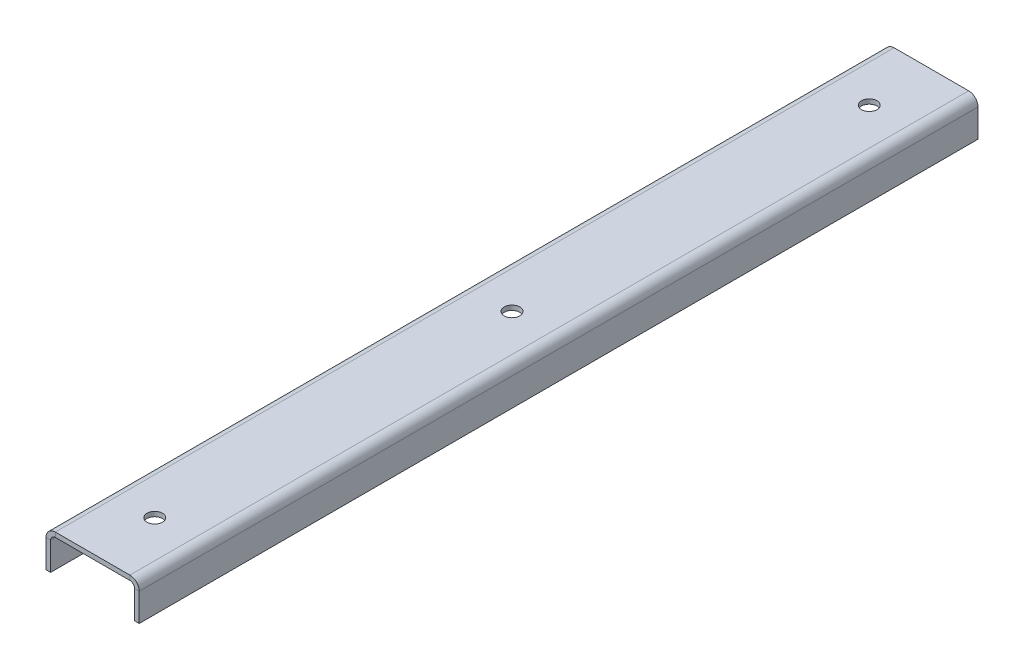
ISO-10303-21;
HEADER;
FILE_DESCRIPTION(('STEP AP214'),'2;1');
FILE_NAME('part.step','',(''),(''),'','','');
FILE_SCHEMA(('AUTOMOTIVE_DESIGN { 1 0 10303 214 1 1 1 1 }'));
ENDSEC;
DATA;
#1=APPLICATION_CONTEXT('core data for automotive mechanical design processes');
#2=APPLICATION_PROTOCOL_DEFINITION('international standard','automotive_design',2000,#1);
#3=PRODUCT_CONTEXT('',#1,'mechanical');
#4=PRODUCT('Part','Part','',(#3));
#5=PRODUCT_RELATED_PRODUCT_CATEGORY('part','',(#4));
#6=PRODUCT_DEFINITION_FORMATION('','',#4);
#7=PRODUCT_DEFINITION_CONTEXT('part definition',#1,'design');
#8=PRODUCT_DEFINITION('design','',#6,#7);
#9=PRODUCT_DEFINITION_SHAPE('','',#8);
#10=(LENGTH_UNIT() NAMED_UNIT(*) SI_UNIT(.MILLI.,.METRE.));
#11=(NAMED_UNIT(*) PLANE_ANGLE_UNIT() SI_UNIT($,.RADIAN.));
#12=(NAMED_UNIT(*) SI_UNIT($,.STERADIAN.) SOLID_ANGLE_UNIT());
#13=UNCERTAINTY_MEASURE_WITH_UNIT(LENGTH_MEASURE(1.E-05),#10,'distance_accuracy_value','');
#14=(GEOMETRIC_REPRESENTATION_CONTEXT(3) GLOBAL_UNCERTAINTY_ASSIGNED_CONTEXT((#13)) GLOBAL_UNIT_ASSIGNED_CONTEXT((#10,
#11,#12)) REPRESENTATION_CONTEXT('',''));
#15=CARTESIAN_POINT('',(0.,0.,0.));
#16=DIRECTION('',(0.,0.,1.));
#17=DIRECTION('',(1.,0.,0.));
#18=AXIS2_PLACEMENT_3D('',#15,#16,#17);
#19=CARTESIAN_POINT('',(12.,0.,135.));
#20=DIRECTION('',(0.,0.,1.));
#21=DIRECTION('',(1.,0.,0.));
#22=AXIS2_PLACEMENT_3D('',#19,#20,#21);
#23=PLANE('',#22);
#24=DIRECTION('',(0.,1.,0.));
#25=VECTOR('',#24,1.);
#26=CARTESIAN_POINT('',(12.,0.,135.));
#27=LINE('',#26,#25);
#28=CARTESIAN_POINT('',(12.,0.,135.));
#29=VERTEX_POINT('',#28);
#30=CARTESIAN_POINT('',(12.,1.5,135.));
#31=VERTEX_POINT('',#30);
#32=EDGE_CURVE('E11',#29,#31,#27,.T.);
#33=ORIENTED_EDGE('',*,*,#32,.F.);
#34=CARTESIAN_POINT('',(12.,-1.5,135.));
#35=DIRECTION('',(0.,0.,-1.));
#36=DIRECTION('',(-1.,0.,0.));
#37=AXIS2_PLACEMENT_3D('',#34,#35,#36);
#38=CIRCLE('',#37,1.5);
#39=CARTESIAN_POINT('',(13.5,-1.49999999999999,135.));
#40=VERTEX_POINT('',#39);
#41=EDGE_CURVE('E256',#40,#29,#38,.F.);
#42=ORIENTED_EDGE('',*,*,#41,.F.);
#43=DIRECTION('',(-1.,0.,0.));
#44=VECTOR('',#43,1.);
#45=CARTESIAN_POINT('',(15.,-1.49999999999999,135.));
#46=LINE('',#45,#44);
#47=CARTESIAN_POINT('',(15.,-1.49999999999999,135.));
#48=VERTEX_POINT('',#47);
#49=EDGE_CURVE('E53',#48,#40,#46,.T.);
#50=ORIENTED_EDGE('',*,*,#49,.F.);
#51=CARTESIAN_POINT('',(12.,-1.5,135.));
#52=DIRECTION('',(0.,0.,1.));
#53=DIRECTION('',(1.,0.,0.));
#54=AXIS2_PLACEMENT_3D('',#51,#52,#53);
#55=CIRCLE('',#54,3.);
#56=EDGE_CURVE('E154',#48,#31,#55,.T.);
#57=ORIENTED_EDGE('',*,*,#56,.T.);
#58=EDGE_LOOP('',(#33,#42,#50,#57));
#59=FACE_BOUND('',#58,.T.);
#60=ADVANCED_FACE('F45',(#59),#23,.T.);
#61=CARTESIAN_POINT('',(15.,-1.49999999999999,135.));
#62=DIRECTION('',(0.,0.,1.));
#63=DIRECTION('',(1.,0.,0.));
#64=AXIS2_PLACEMENT_3D('',#61,#62,#63);
#65=PLANE('',#64);
#66=DIRECTION('',(-1.,0.,0.));
#67=VECTOR('',#66,1.);
#68=CARTESIAN_POINT('',(-13.5,0.,135.));
#69=LINE('',#68,#67);
#70=CARTESIAN_POINT('',(-12.,0.,135.));
#71=VERTEX_POINT('',#70);
#72=EDGE_CURVE('E148',#29,#71,#69,.T.);
#73=ORIENTED_EDGE('',*,*,#72,.F.);
#74=ORIENTED_EDGE('',*,*,#32,.T.);
#75=DIRECTION('',(-1.,0.,0.));
#76=VECTOR('',#75,1.);
#77=CARTESIAN_POINT('',(-13.5,1.5,135.));
#78=LINE('',#77,#76);
#79=CARTESIAN_POINT('',(-12.,1.5,135.));
#80=VERTEX_POINT('',#79);
#81=EDGE_CURVE('E145',#31,#80,#78,.T.);
#82=ORIENTED_EDGE('',*,*,#81,.T.);
#83=DIRECTION('',(0.,-1.,0.));
#84=VECTOR('',#83,1.);
#85=CARTESIAN_POINT('',(-12.,1.5,135.));
#86=LINE('',#85,#84);
#87=EDGE_CURVE('E237',#80,#71,#86,.T.);
#88=ORIENTED_EDGE('',*,*,#87,.T.);
#89=EDGE_LOOP('',(#73,#74,#82,#88));
#90=FACE_BOUND('',#89,.T.);
#91=ADVANCED_FACE('F143',(#90),#65,.T.);
#92=CARTESIAN_POINT('',(13.5,-1.49999999999999,-135.));
#93=DIRECTION('',(0.,0.,-1.));
#94=DIRECTION('',(-1.,0.,0.));
#95=AXIS2_PLACEMENT_3D('',#92,#93,#94);
#96=PLANE('',#95);
#97=DIRECTION('',(1.,0.,0.));
#98=VECTOR('',#97,1.);
#99=CARTESIAN_POINT('',(13.5,-1.49999999999999,-135.));
#100=LINE('',#99,#98);
#101=CARTESIAN_POINT('',(13.5,-1.49999999999999,-135.));
#102=VERTEX_POINT('',#101);
#103=CARTESIAN_POINT('',(15.,-1.49999999999999,-135.));
#104=VERTEX_POINT('',#103);
#105=EDGE_CURVE('E242',#102,#104,#100,.T.);
#106=ORIENTED_EDGE('',*,*,#105,.F.);
#107=CARTESIAN_POINT('',(12.,-1.5,-135.));
#108=DIRECTION('',(0.,0.,-1.));
#109=DIRECTION('',(-1.,0.,0.));
#110=AXIS2_PLACEMENT_3D('',#107,#108,#109);
#111=CIRCLE('',#110,1.5);
#112=CARTESIAN_POINT('',(12.,0.,-135.));
#113=VERTEX_POINT('',#112);
#114=EDGE_CURVE('E194',#102,#113,#111,.F.);
#115=ORIENTED_EDGE('',*,*,#114,.T.);
#116=DIRECTION('',(0.,-1.,0.));
#117=VECTOR('',#116,1.);
#118=CARTESIAN_POINT('',(12.,1.5,-135.));
#119=LINE('',#118,#117);
#120=CARTESIAN_POINT('',(12.,1.5,-135.));
#121=VERTEX_POINT('',#120);
#122=EDGE_CURVE('E240',#121,#113,#119,.T.);
#123=ORIENTED_EDGE('',*,*,#122,.F.);
#124=CARTESIAN_POINT('',(12.,-1.5,-135.));
#125=DIRECTION('',(0.,0.,1.));
#126=DIRECTION('',(1.,0.,0.));
#127=AXIS2_PLACEMENT_3D('',#124,#125,#126);
#128=CIRCLE('',#127,3.);
#129=EDGE_CURVE('E166',#104,#121,#128,.T.);
#130=ORIENTED_EDGE('',*,*,#129,.F.);
#131=EDGE_LOOP('',(#106,#115,#123,#130));
#132=FACE_BOUND('',#131,.T.);
#133=ADVANCED_FACE('F324',(#132),#96,.T.);
#134=CARTESIAN_POINT('',(12.,1.5,-135.));
#135=DIRECTION('',(0.,0.,-1.));
#136=DIRECTION('',(-1.,0.,0.));
#137=AXIS2_PLACEMENT_3D('',#134,#135,#136);
#138=PLANE('',#137);
#139=DIRECTION('',(0.,1.,0.));
#140=VECTOR('',#139,1.);
#141=CARTESIAN_POINT('',(13.5,0.,-135.));
#142=LINE('',#141,#140);
#143=CARTESIAN_POINT('',(13.5,-10.5,-135.));
#144=VERTEX_POINT('',#143);
#145=EDGE_CURVE('E197',#144,#102,#142,.T.);
#146=ORIENTED_EDGE('',*,*,#145,.T.);
#147=ORIENTED_EDGE('',*,*,#105,.T.);
#148=DIRECTION('',(0.,1.,0.));
#149=VECTOR('',#148,1.);
#150=CARTESIAN_POINT('',(15.,0.,-135.));
#151=LINE('',#150,#149);
#152=CARTESIAN_POINT('',(15.,-10.5,-135.));
#153=VERTEX_POINT('',#152);
#154=EDGE_CURVE('E203',#153,#104,#151,.T.);
#155=ORIENTED_EDGE('',*,*,#154,.F.);
#156=DIRECTION('',(-1.,0.,0.));
#157=VECTOR('',#156,1.);
#158=CARTESIAN_POINT('',(15.,-10.5,-135.));
#159=LINE('',#158,#157);
#160=EDGE_CURVE('E200',#153,#144,#159,.T.);
#161=ORIENTED_EDGE('',*,*,#160,.T.);
#162=EDGE_LOOP('',(#146,#147,#155,#161));
#163=FACE_BOUND('',#162,.T.);
#164=ADVANCED_FACE('F328',(#163),#138,.T.);
#165=CARTESIAN_POINT('',(-13.5,-1.5,135.));
#166=DIRECTION('',(0.,0.,1.));
#167=DIRECTION('',(1.,0.,0.));
#168=AXIS2_PLACEMENT_3D('',#165,#166,#167);
#169=PLANE('',#168);
#170=DIRECTION('',(-1.,0.,0.));
#171=VECTOR('',#170,1.);
#172=CARTESIAN_POINT('',(-13.5,-1.5,135.));
#173=LINE('',#172,#171);
#174=CARTESIAN_POINT('',(-13.5,-1.5,135.));
#175=VERTEX_POINT('',#174);
#176=CARTESIAN_POINT('',(-15.,-1.5,135.));
#177=VERTEX_POINT('',#176);
#178=EDGE_CURVE('E61',#175,#177,#173,.T.);
#179=ORIENTED_EDGE('',*,*,#178,.F.);
#180=CARTESIAN_POINT('',(-12.,-1.5,135.));
#181=DIRECTION('',(0.,0.,-1.));
#182=DIRECTION('',(-1.,0.,0.));
#183=AXIS2_PLACEMENT_3D('',#180,#181,#182);
#184=CIRCLE('',#183,1.5);
#185=EDGE_CURVE('E266',#71,#175,#184,.F.);
#186=ORIENTED_EDGE('',*,*,#185,.F.);
#187=ORIENTED_EDGE('',*,*,#87,.F.);
#188=CARTESIAN_POINT('',(-12.,-1.5,135.));
#189=DIRECTION('',(0.,0.,1.));
#190=DIRECTION('',(1.,0.,0.));
#191=AXIS2_PLACEMENT_3D('',#188,#189,#190);
#192=CIRCLE('',#191,3.);
#193=EDGE_CURVE('E174',#80,#177,#192,.T.);
#194=ORIENTED_EDGE('',*,*,#193,.T.);
#195=EDGE_LOOP('',(#179,#186,#187,#194));
#196=FACE_BOUND('',#195,.T.);
#197=ADVANCED_FACE('F334',(#196),#169,.T.);
#198=CARTESIAN_POINT('',(-12.,1.5,135.));
#199=DIRECTION('',(0.,0.,1.));
#200=DIRECTION('',(1.,0.,0.));
#201=AXIS2_PLACEMENT_3D('',#198,#199,#200);
#202=PLANE('',#201);
#203=DIRECTION('',(0.,-1.,0.));
#204=VECTOR('',#203,1.);
#205=CARTESIAN_POINT('',(-13.5,0.,135.));
#206=LINE('',#205,#204);
#207=CARTESIAN_POINT('',(-13.5,-10.5,135.));
#208=VERTEX_POINT('',#207);
#209=EDGE_CURVE('E269',#175,#208,#206,.T.);
#210=ORIENTED_EDGE('',*,*,#209,.F.);
#211=ORIENTED_EDGE('',*,*,#178,.T.);
#212=DIRECTION('',(0.,-1.,0.));
#213=VECTOR('',#212,1.);
#214=CARTESIAN_POINT('',(-15.,0.,135.));
#215=LINE('',#214,#213);
#216=CARTESIAN_POINT('',(-15.,-10.5,135.));
#217=VERTEX_POINT('',#216);
#218=EDGE_CURVE('E115',#177,#217,#215,.T.);
#219=ORIENTED_EDGE('',*,*,#218,.T.);
#220=DIRECTION('',(-1.,0.,0.));
#221=VECTOR('',#220,1.);
#222=CARTESIAN_POINT('',(-13.5,-10.5,135.));
#223=LINE('',#222,#221);
#224=EDGE_CURVE('E272',#208,#217,#223,.T.);
#225=ORIENTED_EDGE('',*,*,#224,.F.);
#226=EDGE_LOOP('',(#210,#211,#219,#225));
#227=FACE_BOUND('',#226,.T.);
#228=ADVANCED_FACE('F338',(#227),#202,.T.);
#229=CARTESIAN_POINT('',(-12.,0.,-135.));
#230=DIRECTION('',(0.,0.,-1.));
#231=DIRECTION('',(-1.,0.,0.));
#232=AXIS2_PLACEMENT_3D('',#229,#230,#231);
#233=PLANE('',#232);
#234=DIRECTION('',(0.,1.,0.));
#235=VECTOR('',#234,1.);
#236=CARTESIAN_POINT('',(-12.,0.,-135.));
#237=LINE('',#236,#235);
#238=CARTESIAN_POINT('',(-12.,0.,-135.));
#239=VERTEX_POINT('',#238);
#240=CARTESIAN_POINT('',(-12.,1.5,-135.));
#241=VERTEX_POINT('',#240);
#242=EDGE_CURVE('E102',#239,#241,#237,.T.);
#243=ORIENTED_EDGE('',*,*,#242,.F.);
#244=CARTESIAN_POINT('',(-12.,-1.5,-135.));
#245=DIRECTION('',(0.,0.,-1.));
#246=DIRECTION('',(-1.,0.,0.));
#247=AXIS2_PLACEMENT_3D('',#244,#245,#246);
#248=CIRCLE('',#247,1.5);
#249=CARTESIAN_POINT('',(-13.5,-1.5,-135.));
#250=VERTEX_POINT('',#249);
#251=EDGE_CURVE('E190',#239,#250,#248,.F.);
#252=ORIENTED_EDGE('',*,*,#251,.T.);
#253=DIRECTION('',(1.,0.,0.));
#254=VECTOR('',#253,1.);
#255=CARTESIAN_POINT('',(-15.,-1.5,-135.));
#256=LINE('',#255,#254);
#257=CARTESIAN_POINT('',(-15.,-1.5,-135.));
#258=VERTEX_POINT('',#257);
#259=EDGE_CURVE('E109',#258,#250,#256,.T.);
#260=ORIENTED_EDGE('',*,*,#259,.F.);
#261=CARTESIAN_POINT('',(-12.,-1.5,-135.));
#262=DIRECTION('',(0.,0.,1.));
#263=DIRECTION('',(1.,0.,0.));
#264=AXIS2_PLACEMENT_3D('',#261,#262,#263);
#265=CIRCLE('',#264,3.);
#266=EDGE_CURVE('E209',#241,#258,#265,.T.);
#267=ORIENTED_EDGE('',*,*,#266,.F.);
#268=EDGE_LOOP('',(#243,#252,#260,#267));
#269=FACE_BOUND('',#268,.T.);
#270=ADVANCED_FACE('F342',(#269),#233,.T.);
#271=CARTESIAN_POINT('',(-15.,-1.5,-135.));
#272=DIRECTION('',(0.,0.,-1.));
#273=DIRECTION('',(-1.,0.,0.));
#274=AXIS2_PLACEMENT_3D('',#271,#272,#273);
#275=PLANE('',#274);
#276=DIRECTION('',(-1.,0.,0.));
#277=VECTOR('',#276,1.);
#278=CARTESIAN_POINT('',(-13.5,0.,-135.));
#279=LINE('',#278,#277);
#280=EDGE_CURVE('E192',#113,#239,#279,.T.);
#281=ORIENTED_EDGE('',*,*,#280,.T.);
#282=ORIENTED_EDGE('',*,*,#242,.T.);
#283=DIRECTION('',(-1.,0.,0.));
#284=VECTOR('',#283,1.);
#285=CARTESIAN_POINT('',(-13.5,1.5,-135.));
#286=LINE('',#285,#284);
#287=EDGE_CURVE('E207',#121,#241,#286,.T.);
#288=ORIENTED_EDGE('',*,*,#287,.F.);
#289=ORIENTED_EDGE('',*,*,#122,.T.);
#290=EDGE_LOOP('',(#281,#282,#288,#289));
#291=FACE_BOUND('',#290,.T.);
#292=ADVANCED_FACE('F345',(#291),#275,.T.);
#293=CARTESIAN_POINT('',(-15.,0.,135.));
#294=DIRECTION('',(1.,0.,0.));
#295=DIRECTION('',(0.,1.,0.));
#296=AXIS2_PLACEMENT_3D('',#293,#294,#295);
#297=PLANE('',#296);
#298=DIRECTION('',(0.,-1.,0.));
#299=VECTOR('',#298,1.);
#300=CARTESIAN_POINT('',(-15.,0.,-135.));
#301=LINE('',#300,#299);
#302=CARTESIAN_POINT('',(-15.,-10.5,-135.));
#303=VERTEX_POINT('',#302);
#304=EDGE_CURVE('E180',#258,#303,#301,.T.);
#305=ORIENTED_EDGE('',*,*,#304,.T.);
#306=DIRECTION('',(0.,0.,-1.));
#307=VECTOR('',#306,1.);
#308=CARTESIAN_POINT('',(-15.,-10.5,135.));
#309=LINE('',#308,#307);
#310=EDGE_CURVE('E233',#217,#303,#309,.T.);
#311=ORIENTED_EDGE('',*,*,#310,.F.);
#312=ORIENTED_EDGE('',*,*,#218,.F.);
#313=DIRECTION('',(0.,0.,-1.));
#314=VECTOR('',#313,1.);
#315=CARTESIAN_POINT('',(-15.,-1.5,135.));
#316=LINE('',#315,#314);
#317=EDGE_CURVE('E176',#177,#258,#316,.T.);
#318=ORIENTED_EDGE('',*,*,#317,.T.);
#319=EDGE_LOOP('',(#305,#311,#312,#318));
#320=FACE_BOUND('',#319,.T.);
#321=ADVANCED_FACE('F348',(#320),#297,.F.);
#322=CARTESIAN_POINT('',(-13.5,-10.5,135.));
#323=DIRECTION('',(0.,-1.,0.));
#324=DIRECTION('',(0.,0.,-1.));
#325=AXIS2_PLACEMENT_3D('',#322,#323,#324);
#326=PLANE('',#325);
#327=DIRECTION('',(-1.,0.,0.));
#328=VECTOR('',#327,1.);
#329=CARTESIAN_POINT('',(-13.5,-10.5,-135.));
#330=LINE('',#329,#328);
#331=CARTESIAN_POINT('',(-13.5,-10.5,-135.));
#332=VERTEX_POINT('',#331);
#333=EDGE_CURVE('E183',#332,#303,#330,.T.);
#334=ORIENTED_EDGE('',*,*,#333,.F.);
#335=DIRECTION('',(0.,0.,-1.));
#336=VECTOR('',#335,1.);
#337=CARTESIAN_POINT('',(-13.5,-10.5,135.));
#338=LINE('',#337,#336);
#339=EDGE_CURVE('E231',#208,#332,#338,.T.);
#340=ORIENTED_EDGE('',*,*,#339,.F.);
#341=ORIENTED_EDGE('',*,*,#224,.T.);
#342=ORIENTED_EDGE('',*,*,#310,.T.);
#343=EDGE_LOOP('',(#334,#340,#341,#342));
#344=FACE_BOUND('',#343,.T.);
#345=ADVANCED_FACE('F351',(#344),#326,.T.);
#346=CARTESIAN_POINT('',(-13.5,0.,135.));
#347=DIRECTION('',(1.,0.,0.));
#348=DIRECTION('',(0.,1.,0.));
#349=AXIS2_PLACEMENT_3D('',#346,#347,#348);
#350=PLANE('',#349);
#351=DIRECTION('',(0.,-1.,0.));
#352=VECTOR('',#351,1.);
#353=CARTESIAN_POINT('',(-13.5,0.,-135.));
#354=LINE('',#353,#352);
#355=EDGE_CURVE('E187',#250,#332,#354,.T.);
#356=ORIENTED_EDGE('',*,*,#355,.F.);
#357=DIRECTION('',(0.,0.,-1.));
#358=VECTOR('',#357,1.);
#359=CARTESIAN_POINT('',(-13.5,-1.5,135.));
#360=LINE('',#359,#358);
#361=EDGE_CURVE('E228',#175,#250,#360,.T.);
#362=ORIENTED_EDGE('',*,*,#361,.F.);
#363=ORIENTED_EDGE('',*,*,#209,.T.);
#364=ORIENTED_EDGE('',*,*,#339,.T.);
#365=EDGE_LOOP('',(#356,#362,#363,#364));
#366=FACE_BOUND('',#365,.T.);
#367=ADVANCED_FACE('F355',(#366),#350,.T.);
#368=CARTESIAN_POINT('',(-12.,-1.5,135.));
#369=DIRECTION('',(0.,0.,-1.));
#370=DIRECTION('',(-1.,0.,0.));
#371=AXIS2_PLACEMENT_3D('',#368,#369,#370);
#372=CYLINDRICAL_SURFACE('',#371,1.5);
#373=ORIENTED_EDGE('',*,*,#251,.F.);
#374=DIRECTION('',(0.,0.,-1.));
#375=VECTOR('',#374,1.);
#376=CARTESIAN_POINT('',(-12.,0.,135.));
#377=LINE('',#376,#375);
#378=EDGE_CURVE('E225',#71,#239,#377,.T.);
#379=ORIENTED_EDGE('',*,*,#378,.F.);
#380=ORIENTED_EDGE('',*,*,#185,.T.);
#381=ORIENTED_EDGE('',*,*,#361,.T.);
#382=EDGE_LOOP('',(#373,#379,#380,#381));
#383=FACE_BOUND('',#382,.T.);
#384=ADVANCED_FACE('F359',(#383),#372,.F.);
#385=CARTESIAN_POINT('',(-13.5,0.,135.));
#386=DIRECTION('',(0.,-1.,0.));
#387=DIRECTION('',(1.,0.,0.));
#388=AXIS2_PLACEMENT_3D('',#385,#386,#387);
#389=PLANE('',#388);
#390=CARTESIAN_POINT('',(0.,0.,115.));
#391=DIRECTION('',(0.,1.,0.));
#392=DIRECTION('',(-1.,0.,0.));
#393=AXIS2_PLACEMENT_3D('',#390,#391,#392);
#394=CIRCLE('',#393,2.5);
#395=CARTESIAN_POINT('',(-2.49999999999999,0.,115.));
#396=VERTEX_POINT('',#395);
#397=EDGE_CURVE('E282',#396,#396,#394,.T.);
#398=ORIENTED_EDGE('',*,*,#397,.T.);
#399=EDGE_LOOP('',(#398));
#400=FACE_BOUND('',#399,.T.);
#401=CARTESIAN_POINT('',(0.,0.,-115.));
#402=DIRECTION('',(0.,1.,0.));
#403=DIRECTION('',(-1.,0.,0.));
#404=AXIS2_PLACEMENT_3D('',#401,#402,#403);
#405=CIRCLE('',#404,2.5);
#406=CARTESIAN_POINT('',(-2.5,0.,-115.));
#407=VERTEX_POINT('',#406);
#408=EDGE_CURVE('E288',#407,#407,#405,.T.);
#409=ORIENTED_EDGE('',*,*,#408,.T.);
#410=EDGE_LOOP('',(#409));
#411=FACE_BOUND('',#410,.T.);
#412=CARTESIAN_POINT('',(0.,0.,0.));
#413=DIRECTION('',(0.,1.,0.));
#414=DIRECTION('',(-1.,0.,0.));
#415=AXIS2_PLACEMENT_3D('',#412,#413,#414);
#416=CIRCLE('',#415,2.5);
#417=CARTESIAN_POINT('',(-2.5,0.,0.));
#418=VERTEX_POINT('',#417);
#419=EDGE_CURVE('E184',#418,#418,#416,.T.);
#420=ORIENTED_EDGE('',*,*,#419,.T.);
#421=EDGE_LOOP('',(#420));
#422=FACE_BOUND('',#421,.T.);
#423=ORIENTED_EDGE('',*,*,#280,.F.);
#424=DIRECTION('',(0.,0.,-1.));
#425=VECTOR('',#424,1.);
#426=CARTESIAN_POINT('',(12.,0.,135.));
#427=LINE('',#426,#425);
#428=EDGE_CURVE('E222',#29,#113,#427,.T.);
#429=ORIENTED_EDGE('',*,*,#428,.F.);
#430=ORIENTED_EDGE('',*,*,#72,.T.);
#431=ORIENTED_EDGE('',*,*,#378,.T.);
#432=EDGE_LOOP('',(#423,#429,#430,#431));
#433=FACE_BOUND('',#432,.T.);
#434=ADVANCED_FACE('F363',(#400,#411,#422,#433),#389,.T.);
#435=CARTESIAN_POINT('',(12.,-1.5,135.));
#436=DIRECTION('',(0.,0.,-1.));
#437=DIRECTION('',(-1.,0.,0.));
#438=AXIS2_PLACEMENT_3D('',#435,#436,#437);
#439=CYLINDRICAL_SURFACE('',#438,1.5);
#440=ORIENTED_EDGE('',*,*,#114,.F.);
#441=DIRECTION('',(0.,0.,-1.));
#442=VECTOR('',#441,1.);
#443=CARTESIAN_POINT('',(13.5,-1.49999999999999,135.));
#444=LINE('',#443,#442);
#445=EDGE_CURVE('E219',#40,#102,#444,.T.);
#446=ORIENTED_EDGE('',*,*,#445,.F.);
#447=ORIENTED_EDGE('',*,*,#41,.T.);
#448=ORIENTED_EDGE('',*,*,#428,.T.);
#449=EDGE_LOOP('',(#440,#446,#447,#448));
#450=FACE_BOUND('',#449,.T.);
#451=ADVANCED_FACE('F255',(#450),#439,.F.);
#452=CARTESIAN_POINT('',(13.5,0.,135.));
#453=DIRECTION('',(-1.,0.,0.));
#454=DIRECTION('',(0.,0.,1.));
#455=AXIS2_PLACEMENT_3D('',#452,#453,#454);
#456=PLANE('',#455);
#457=ORIENTED_EDGE('',*,*,#145,.F.);
#458=DIRECTION('',(0.,0.,-1.));
#459=VECTOR('',#458,1.);
#460=CARTESIAN_POINT('',(13.5,-10.5,135.));
#461=LINE('',#460,#459);
#462=CARTESIAN_POINT('',(13.5,-10.5,135.));
#463=VERTEX_POINT('',#462);
#464=EDGE_CURVE('E217',#463,#144,#461,.T.);
#465=ORIENTED_EDGE('',*,*,#464,.F.);
#466=DIRECTION('',(0.,1.,0.));
#467=VECTOR('',#466,1.);
#468=CARTESIAN_POINT('',(13.5,0.,135.));
#469=LINE('',#468,#467);
#470=EDGE_CURVE('E249',#463,#40,#469,.T.);
#471=ORIENTED_EDGE('',*,*,#470,.T.);
#472=ORIENTED_EDGE('',*,*,#445,.T.);
#473=EDGE_LOOP('',(#457,#465,#471,#472));
#474=FACE_BOUND('',#473,.T.);
#475=ADVANCED_FACE('F260',(#474),#456,.T.);
#476=CARTESIAN_POINT('',(15.,-10.5,135.));
#477=DIRECTION('',(0.,-1.,0.));
#478=DIRECTION('',(0.,0.,-1.));
#479=AXIS2_PLACEMENT_3D('',#476,#477,#478);
#480=PLANE('',#479);
#481=ORIENTED_EDGE('',*,*,#160,.F.);
#482=DIRECTION('',(0.,0.,-1.));
#483=VECTOR('',#482,1.);
#484=CARTESIAN_POINT('',(15.,-10.5,135.));
#485=LINE('',#484,#483);
#486=CARTESIAN_POINT('',(15.,-10.5,135.));
#487=VERTEX_POINT('',#486);
#488=EDGE_CURVE('E215',#487,#153,#485,.T.);
#489=ORIENTED_EDGE('',*,*,#488,.F.);
#490=DIRECTION('',(-1.,0.,0.));
#491=VECTOR('',#490,1.);
#492=CARTESIAN_POINT('',(15.,-10.5,135.));
#493=LINE('',#492,#491);
#494=EDGE_CURVE('E261',#487,#463,#493,.T.);
#495=ORIENTED_EDGE('',*,*,#494,.T.);
#496=ORIENTED_EDGE('',*,*,#464,.T.);
#497=EDGE_LOOP('',(#481,#489,#495,#496));
#498=FACE_BOUND('',#497,.T.);
#499=ADVANCED_FACE('F372',(#498),#480,.T.);
#500=CARTESIAN_POINT('',(15.,0.,135.));
#501=DIRECTION('',(-1.,0.,0.));
#502=DIRECTION('',(0.,0.,1.));
#503=AXIS2_PLACEMENT_3D('',#500,#501,#502);
#504=PLANE('',#503);
#505=ORIENTED_EDGE('',*,*,#154,.T.);
#506=DIRECTION('',(0.,0.,-1.));
#507=VECTOR('',#506,1.);
#508=CARTESIAN_POINT('',(15.,-1.49999999999999,135.));
#509=LINE('',#508,#507);
#510=EDGE_CURVE('E168',#48,#104,#509,.T.);
#511=ORIENTED_EDGE('',*,*,#510,.F.);
#512=DIRECTION('',(0.,1.,0.));
#513=VECTOR('',#512,1.);
#514=CARTESIAN_POINT('',(15.,0.,135.));
#515=LINE('',#514,#513);
#516=EDGE_CURVE('E159',#487,#48,#515,.T.);
#517=ORIENTED_EDGE('',*,*,#516,.F.);
#518=ORIENTED_EDGE('',*,*,#488,.T.);
#519=EDGE_LOOP('',(#505,#511,#517,#518));
#520=FACE_BOUND('',#519,.T.);
#521=ADVANCED_FACE('F375',(#520),#504,.F.);
#522=CARTESIAN_POINT('',(12.,-1.5,135.));
#523=DIRECTION('',(0.,0.,-1.));
#524=DIRECTION('',(-1.,0.,0.));
#525=AXIS2_PLACEMENT_3D('',#522,#523,#524);
#526=CYLINDRICAL_SURFACE('',#525,3.);
#527=ORIENTED_EDGE('',*,*,#129,.T.);
#528=DIRECTION('',(0.,0.,-1.));
#529=VECTOR('',#528,1.);
#530=CARTESIAN_POINT('',(12.,1.5,135.));
#531=LINE('',#530,#529);
#532=EDGE_CURVE('E163',#31,#121,#531,.T.);
#533=ORIENTED_EDGE('',*,*,#532,.F.);
#534=ORIENTED_EDGE('',*,*,#56,.F.);
#535=ORIENTED_EDGE('',*,*,#510,.T.);
#536=EDGE_LOOP('',(#527,#533,#534,#535));
#537=FACE_BOUND('',#536,.T.);
#538=ADVANCED_FACE('F164',(#537),#526,.T.);
#539=CARTESIAN_POINT('',(-13.5,1.5,135.));
#540=DIRECTION('',(0.,-1.,0.));
#541=DIRECTION('',(1.,0.,0.));
#542=AXIS2_PLACEMENT_3D('',#539,#540,#541);
#543=PLANE('',#542);
#544=CARTESIAN_POINT('',(0.,1.5,115.));
#545=DIRECTION('',(0.,1.,0.));
#546=DIRECTION('',(-1.,0.,0.));
#547=AXIS2_PLACEMENT_3D('',#544,#545,#546);
#548=CIRCLE('',#547,2.5);
#549=CARTESIAN_POINT('',(-2.49999999999999,1.5,115.));
#550=VERTEX_POINT('',#549);
#551=EDGE_CURVE('E279',#550,#550,#548,.T.);
#552=ORIENTED_EDGE('',*,*,#551,.F.);
#553=EDGE_LOOP('',(#552));
#554=FACE_BOUND('',#553,.T.);
#555=CARTESIAN_POINT('',(0.,1.5,-115.));
#556=DIRECTION('',(0.,1.,0.));
#557=DIRECTION('',(-1.,0.,0.));
#558=AXIS2_PLACEMENT_3D('',#555,#556,#557);
#559=CIRCLE('',#558,2.5);
#560=CARTESIAN_POINT('',(-2.5,1.5,-115.));
#561=VERTEX_POINT('',#560);
#562=EDGE_CURVE('E285',#561,#561,#559,.T.);
#563=ORIENTED_EDGE('',*,*,#562,.F.);
#564=EDGE_LOOP('',(#563));
#565=FACE_BOUND('',#564,.T.);
#566=CARTESIAN_POINT('',(0.,1.5,0.));
#567=DIRECTION('',(0.,1.,0.));
#568=DIRECTION('',(-1.,0.,0.));
#569=AXIS2_PLACEMENT_3D('',#566,#567,#568);
#570=CIRCLE('',#569,2.5);
#571=CARTESIAN_POINT('',(-2.5,1.5,0.));
#572=VERTEX_POINT('',#571);
#573=EDGE_CURVE('E276',#572,#572,#570,.T.);
#574=ORIENTED_EDGE('',*,*,#573,.F.);
#575=EDGE_LOOP('',(#574));
#576=FACE_BOUND('',#575,.T.);
#577=ORIENTED_EDGE('',*,*,#287,.T.);
#578=DIRECTION('',(0.,0.,-1.));
#579=VECTOR('',#578,1.);
#580=CARTESIAN_POINT('',(-12.,1.5,135.));
#581=LINE('',#580,#579);
#582=EDGE_CURVE('E169',#80,#241,#581,.T.);
#583=ORIENTED_EDGE('',*,*,#582,.F.);
#584=ORIENTED_EDGE('',*,*,#81,.F.);
#585=ORIENTED_EDGE('',*,*,#532,.T.);
#586=EDGE_LOOP('',(#577,#583,#584,#585));
#587=FACE_BOUND('',#586,.T.);
#588=ADVANCED_FACE('F171',(#554,#565,#576,#587),#543,.F.);
#589=CARTESIAN_POINT('',(-12.,-1.5,135.));
#590=DIRECTION('',(0.,0.,-1.));
#591=DIRECTION('',(-1.,0.,0.));
#592=AXIS2_PLACEMENT_3D('',#589,#590,#591);
#593=CYLINDRICAL_SURFACE('',#592,3.);
#594=ORIENTED_EDGE('',*,*,#266,.T.);
#595=ORIENTED_EDGE('',*,*,#317,.F.);
#596=ORIENTED_EDGE('',*,*,#193,.F.);
#597=ORIENTED_EDGE('',*,*,#582,.T.);
#598=EDGE_LOOP('',(#594,#595,#596,#597));
#599=FACE_BOUND('',#598,.T.);
#600=ADVANCED_FACE('F298',(#599),#593,.T.);
#601=CARTESIAN_POINT('',(-12.,-1.5,135.));
#602=DIRECTION('',(0.,0.,-1.));
#603=DIRECTION('',(-1.,0.,0.));
#604=AXIS2_PLACEMENT_3D('',#601,#602,#603);
#605=PLANE('',#604);
#606=ORIENTED_EDGE('',*,*,#516,.T.);
#607=ORIENTED_EDGE('',*,*,#49,.T.);
#608=ORIENTED_EDGE('',*,*,#470,.F.);
#609=ORIENTED_EDGE('',*,*,#494,.F.);
#610=EDGE_LOOP('',(#606,#607,#608,#609));
#611=FACE_BOUND('',#610,.T.);
#612=ADVANCED_FACE('F246',(#611),#605,.F.);
#613=CARTESIAN_POINT('',(-12.,-1.5,-135.));
#614=DIRECTION('',(0.,0.,-1.));
#615=DIRECTION('',(-1.,0.,0.));
#616=AXIS2_PLACEMENT_3D('',#613,#614,#615);
#617=PLANE('',#616);
#618=ORIENTED_EDGE('',*,*,#304,.F.);
#619=ORIENTED_EDGE('',*,*,#259,.T.);
#620=ORIENTED_EDGE('',*,*,#355,.T.);
#621=ORIENTED_EDGE('',*,*,#333,.T.);
#622=EDGE_LOOP('',(#618,#619,#620,#621));
#623=FACE_BOUND('',#622,.T.);
#624=ADVANCED_FACE('F305',(#623),#617,.T.);
#625=CARTESIAN_POINT('',(0.,0.,0.));
#626=DIRECTION('',(0.,1.,0.));
#627=DIRECTION('',(-1.,0.,0.));
#628=AXIS2_PLACEMENT_3D('',#625,#626,#627);
#629=CYLINDRICAL_SURFACE('',#628,2.5);
#630=ORIENTED_EDGE('',*,*,#419,.F.);
#631=EDGE_LOOP('',(#630));
#632=FACE_BOUND('',#631,.T.);
#633=ORIENTED_EDGE('',*,*,#573,.T.);
#634=EDGE_LOOP('',(#633));
#635=FACE_BOUND('',#634,.T.);
#636=ADVANCED_FACE('F303',(#632,#635),#629,.F.);
#637=CARTESIAN_POINT('',(0.,0.,-115.));
#638=DIRECTION('',(0.,1.,0.));
#639=DIRECTION('',(-1.,0.,0.));
#640=AXIS2_PLACEMENT_3D('',#637,#638,#639);
#641=CYLINDRICAL_SURFACE('',#640,2.5);
#642=ORIENTED_EDGE('',*,*,#408,.F.);
#643=EDGE_LOOP('',(#642));
#644=FACE_BOUND('',#643,.T.);
#645=ORIENTED_EDGE('',*,*,#562,.T.);
#646=EDGE_LOOP('',(#645));
#647=FACE_BOUND('',#646,.T.);
#648=ADVANCED_FACE('F294',(#644,#647),#641,.F.);
#649=CARTESIAN_POINT('',(0.,0.,115.));
#650=DIRECTION('',(0.,1.,0.));
#651=DIRECTION('',(-1.,0.,0.));
#652=AXIS2_PLACEMENT_3D('',#649,#650,#651);
#653=CYLINDRICAL_SURFACE('',#652,2.5);
#654=ORIENTED_EDGE('',*,*,#397,.F.);
#655=EDGE_LOOP('',(#654));
#656=FACE_BOUND('',#655,.T.);
#657=ORIENTED_EDGE('',*,*,#551,.T.);
#658=EDGE_LOOP('',(#657));
#659=FACE_BOUND('',#658,.T.);
#660=ADVANCED_FACE('F311',(#656,#659),#653,.F.);
#661=CLOSED_SHELL('',(#60,#91,#133,#164,#197,#228,#270,#292,#321,#345,#367,#384,#434,#451,#475,
#499,#521,#538,#588,#600,#612,#624,#636,#648,#660));
#662=MANIFOLD_SOLID_BREP('B2',#661);
#663=ADVANCED_BREP_SHAPE_REPRESENTATION('',(#18,#662),#14);
#664=SHAPE_DEFINITION_REPRESENTATION(#9,#663);
ENDSEC;
END-ISO-10303-21;
